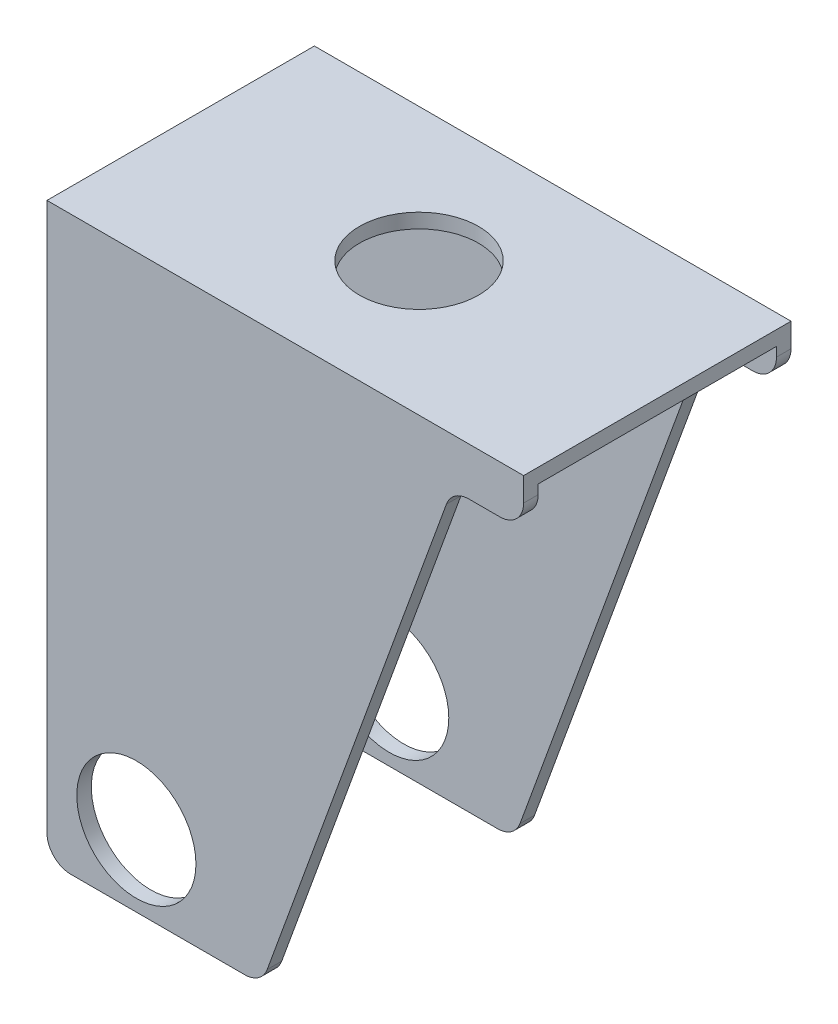
ISO-10303-21;
HEADER;
FILE_DESCRIPTION(('STEP AP214'),'2;1');
FILE_NAME('part.step','',(''),(''),'','','');
FILE_SCHEMA(('AUTOMOTIVE_DESIGN { 1 0 10303 214 1 1 1 1 }'));
ENDSEC;
DATA;
#1=APPLICATION_CONTEXT('core data for automotive mechanical design processes');
#2=APPLICATION_PROTOCOL_DEFINITION('international standard','automotive_design',2000,#1);
#3=PRODUCT_CONTEXT('',#1,'mechanical');
#4=PRODUCT('Part','Part','',(#3));
#5=PRODUCT_RELATED_PRODUCT_CATEGORY('part','',(#4));
#6=PRODUCT_DEFINITION_FORMATION('','',#4);
#7=PRODUCT_DEFINITION_CONTEXT('part definition',#1,'design');
#8=PRODUCT_DEFINITION('design','',#6,#7);
#9=PRODUCT_DEFINITION_SHAPE('','',#8);
#10=(LENGTH_UNIT() NAMED_UNIT(*) SI_UNIT(.MILLI.,.METRE.));
#11=(NAMED_UNIT(*) PLANE_ANGLE_UNIT() SI_UNIT($,.RADIAN.));
#12=(NAMED_UNIT(*) SI_UNIT($,.STERADIAN.) SOLID_ANGLE_UNIT());
#13=UNCERTAINTY_MEASURE_WITH_UNIT(LENGTH_MEASURE(1.E-05),#10,'distance_accuracy_value','');
#14=(GEOMETRIC_REPRESENTATION_CONTEXT(3) GLOBAL_UNCERTAINTY_ASSIGNED_CONTEXT((#13)) GLOBAL_UNIT_ASSIGNED_CONTEXT((#10,
#11,#12)) REPRESENTATION_CONTEXT('',''));
#15=CARTESIAN_POINT('',(0.,0.,0.));
#16=DIRECTION('',(0.,0.,1.));
#17=DIRECTION('',(1.,0.,0.));
#18=AXIS2_PLACEMENT_3D('',#15,#16,#17);
#19=CARTESIAN_POINT('',(50.8,59.3852,-12.7));
#20=DIRECTION('',(0.,0.,-1.));
#21=DIRECTION('',(0.,1.,0.));
#22=AXIS2_PLACEMENT_3D('',#19,#20,#21);
#23=PLANE('',#22);
#24=CARTESIAN_POINT('',(9.525,7.62,-12.7));
#25=DIRECTION('',(0.,0.,-1.));
#26=DIRECTION('',(0.,1.,0.));
#27=AXIS2_PLACEMENT_3D('',#24,#25,#26);
#28=CIRCLE('',#27,6.35);
#29=CARTESIAN_POINT('',(9.525,13.97,-12.7));
#30=VERTEX_POINT('',#29);
#31=EDGE_CURVE('E215',#30,#30,#28,.T.);
#32=ORIENTED_EDGE('',*,*,#31,.T.);
#33=EDGE_LOOP('',(#32));
#34=FACE_BOUND('',#33,.T.);
#35=DIRECTION('',(0.,-1.,0.));
#36=VECTOR('',#35,1.);
#37=CARTESIAN_POINT('',(0.,59.3852,-12.7));
#38=LINE('',#37,#36);
#39=CARTESIAN_POINT('',(0.,59.3852,-12.7));
#40=VERTEX_POINT('',#39);
#41=CARTESIAN_POINT('',(0.,2.54,-12.7));
#42=VERTEX_POINT('',#41);
#43=EDGE_CURVE('E212',#40,#42,#38,.T.);
#44=ORIENTED_EDGE('',*,*,#43,.T.);
#45=CARTESIAN_POINT('',(2.54,2.54,-12.7));
#46=DIRECTION('',(0.,0.,-1.));
#47=DIRECTION('',(0.,1.,0.));
#48=AXIS2_PLACEMENT_3D('',#45,#46,#47);
#49=CIRCLE('',#48,2.54);
#50=CARTESIAN_POINT('',(2.54,0.,-12.7));
#51=VERTEX_POINT('',#50);
#52=EDGE_CURVE('E267',#42,#51,#49,.F.);
#53=ORIENTED_EDGE('',*,*,#52,.T.);
#54=DIRECTION('',(-1.,0.,0.));
#55=VECTOR('',#54,1.);
#56=CARTESIAN_POINT('',(50.8,0.,-12.7));
#57=LINE('',#56,#55);
#58=CARTESIAN_POINT('',(21.0811912038495,0.,-12.7));
#59=VERTEX_POINT('',#58);
#60=EDGE_CURVE('E238',#59,#51,#57,.T.);
#61=ORIENTED_EDGE('',*,*,#60,.F.);
#62=CARTESIAN_POINT('',(21.0811912038495,2.54,-12.7));
#63=DIRECTION('',(0.,0.,-1.));
#64=DIRECTION('',(0.,1.,0.));
#65=AXIS2_PLACEMENT_3D('',#62,#63,#64);
#66=CIRCLE('',#65,2.54);
#67=CARTESIAN_POINT('',(23.4681397038359,1.67162401091899,-12.7));
#68=VERTEX_POINT('',#67);
#69=EDGE_CURVE('E265',#59,#68,#66,.F.);
#70=ORIENTED_EDGE('',*,*,#69,.T.);
#71=DIRECTION('',(0.341880310661818,0.939743503931673,0.));
#72=VECTOR('',#71,1.);
#73=CARTESIAN_POINT('',(45.2049524244005,61.420687976571,-12.7));
#74=LINE('',#73,#72);
#75=CARTESIAN_POINT('',(42.5718602961641,54.182975989081,-12.7));
#76=VERTEX_POINT('',#75);
#77=EDGE_CURVE('E247',#68,#76,#74,.T.);
#78=ORIENTED_EDGE('',*,*,#77,.T.);
#79=CARTESIAN_POINT('',(44.9588087961505,53.3146,-12.7));
#80=DIRECTION('',(0.,0.,-1.));
#81=DIRECTION('',(0.,1.,0.));
#82=AXIS2_PLACEMENT_3D('',#79,#80,#81);
#83=CIRCLE('',#82,2.54);
#84=CARTESIAN_POINT('',(44.9588087961505,55.8546,-12.7));
#85=VERTEX_POINT('',#84);
#86=EDGE_CURVE('E307',#76,#85,#83,.T.);
#87=ORIENTED_EDGE('',*,*,#86,.T.);
#88=DIRECTION('',(1.,0.,0.));
#89=VECTOR('',#88,1.);
#90=CARTESIAN_POINT('',(50.8,55.8546,-12.7));
#91=LINE('',#90,#89);
#92=CARTESIAN_POINT('',(48.26,55.8546,-12.7));
#93=VERTEX_POINT('',#92);
#94=EDGE_CURVE('E364',#85,#93,#91,.T.);
#95=ORIENTED_EDGE('',*,*,#94,.T.);
#96=CARTESIAN_POINT('',(48.26,58.3946,-12.7));
#97=DIRECTION('',(0.,0.,-1.));
#98=DIRECTION('',(0.,1.,0.));
#99=AXIS2_PLACEMENT_3D('',#96,#97,#98);
#100=CIRCLE('',#99,2.54);
#101=CARTESIAN_POINT('',(50.8,58.3946,-12.7));
#102=VERTEX_POINT('',#101);
#103=EDGE_CURVE('E263',#93,#102,#100,.F.);
#104=ORIENTED_EDGE('',*,*,#103,.T.);
#105=DIRECTION('',(0.,-1.,0.));
#106=VECTOR('',#105,1.);
#107=CARTESIAN_POINT('',(50.8,59.3852,-12.7));
#108=LINE('',#107,#106);
#109=CARTESIAN_POINT('',(50.8,59.3852,-12.7));
#110=VERTEX_POINT('',#109);
#111=EDGE_CURVE('E186',#110,#102,#108,.T.);
#112=ORIENTED_EDGE('',*,*,#111,.F.);
#113=DIRECTION('',(-1.,0.,0.));
#114=VECTOR('',#113,1.);
#115=CARTESIAN_POINT('',(50.8,59.3852,-12.7));
#116=LINE('',#115,#114);
#117=EDGE_CURVE('E211',#110,#40,#116,.T.);
#118=ORIENTED_EDGE('',*,*,#117,.T.);
#119=EDGE_LOOP('',(#44,#53,#61,#70,#78,#87,#95,#104,#112,#118));
#120=FACE_BOUND('',#119,.T.);
#121=ADVANCED_FACE('F36',(#34,#120),#23,.F.);
#122=CARTESIAN_POINT('',(50.8,0.,-12.7));
#123=DIRECTION('',(0.,1.,0.));
#124=DIRECTION('',(0.,0.,1.));
#125=AXIS2_PLACEMENT_3D('',#122,#123,#124);
#126=PLANE('',#125);
#127=ORIENTED_EDGE('',*,*,#60,.T.);
#128=DIRECTION('',(0.,0.,-1.));
#129=VECTOR('',#128,1.);
#130=CARTESIAN_POINT('',(2.54,0.,-12.7));
#131=LINE('',#130,#129);
#132=CARTESIAN_POINT('',(2.54,0.,-14.2494));
#133=VERTEX_POINT('',#132);
#134=EDGE_CURVE('E250',#51,#133,#131,.T.);
#135=ORIENTED_EDGE('',*,*,#134,.T.);
#136=DIRECTION('',(-1.,0.,0.));
#137=VECTOR('',#136,1.);
#138=CARTESIAN_POINT('',(50.8,0.,-14.2494));
#139=LINE('',#138,#137);
#140=CARTESIAN_POINT('',(21.0811912038495,0.,-14.2494));
#141=VERTEX_POINT('',#140);
#142=EDGE_CURVE('E196',#141,#133,#139,.T.);
#143=ORIENTED_EDGE('',*,*,#142,.F.);
#144=DIRECTION('',(0.,0.,1.));
#145=VECTOR('',#144,1.);
#146=CARTESIAN_POINT('',(21.0811912038495,0.,-12.7));
#147=LINE('',#146,#145);
#148=EDGE_CURVE('E243',#141,#59,#147,.T.);
#149=ORIENTED_EDGE('',*,*,#148,.T.);
#150=EDGE_LOOP('',(#127,#135,#143,#149));
#151=FACE_BOUND('',#150,.T.);
#152=ADVANCED_FACE('F397',(#151),#126,.F.);
#153=CARTESIAN_POINT('',(50.8,0.,-14.2494));
#154=DIRECTION('',(0.,0.,1.));
#155=DIRECTION('',(1.,0.,0.));
#156=AXIS2_PLACEMENT_3D('',#153,#154,#155);
#157=PLANE('',#156);
#158=CARTESIAN_POINT('',(9.525,7.62,-14.2494));
#159=DIRECTION('',(0.,0.,1.));
#160=DIRECTION('',(1.,0.,0.));
#161=AXIS2_PLACEMENT_3D('',#158,#159,#160);
#162=CIRCLE('',#161,6.35);
#163=CARTESIAN_POINT('',(15.875,7.62,-14.2494));
#164=VERTEX_POINT('',#163);
#165=EDGE_CURVE('E367',#164,#164,#162,.T.);
#166=ORIENTED_EDGE('',*,*,#165,.T.);
#167=EDGE_LOOP('',(#166));
#168=FACE_BOUND('',#167,.T.);
#169=ORIENTED_EDGE('',*,*,#142,.T.);
#170=CARTESIAN_POINT('',(2.54,2.54,-14.2494));
#171=DIRECTION('',(0.,0.,1.));
#172=DIRECTION('',(1.,0.,0.));
#173=AXIS2_PLACEMENT_3D('',#170,#171,#172);
#174=CIRCLE('',#173,2.54);
#175=CARTESIAN_POINT('',(0.,2.54,-14.2494));
#176=VERTEX_POINT('',#175);
#177=EDGE_CURVE('E257',#133,#176,#174,.F.);
#178=ORIENTED_EDGE('',*,*,#177,.T.);
#179=DIRECTION('',(0.,1.,0.));
#180=VECTOR('',#179,1.);
#181=CARTESIAN_POINT('',(0.,0.,-14.2494));
#182=LINE('',#181,#180);
#183=CARTESIAN_POINT('',(0.,60.9346,-14.2494));
#184=VERTEX_POINT('',#183);
#185=EDGE_CURVE('E193',#176,#184,#182,.T.);
#186=ORIENTED_EDGE('',*,*,#185,.T.);
#187=DIRECTION('',(-1.,0.,0.));
#188=VECTOR('',#187,1.);
#189=CARTESIAN_POINT('',(50.8,60.9346,-14.2494));
#190=LINE('',#189,#188);
#191=CARTESIAN_POINT('',(50.8,60.9346,-14.2494));
#192=VERTEX_POINT('',#191);
#193=EDGE_CURVE('E189',#192,#184,#190,.T.);
#194=ORIENTED_EDGE('',*,*,#193,.F.);
#195=DIRECTION('',(0.,1.,0.));
#196=VECTOR('',#195,1.);
#197=CARTESIAN_POINT('',(50.8,0.,-14.2494));
#198=LINE('',#197,#196);
#199=CARTESIAN_POINT('',(50.8,58.3946,-14.2494));
#200=VERTEX_POINT('',#199);
#201=EDGE_CURVE('E174',#200,#192,#198,.T.);
#202=ORIENTED_EDGE('',*,*,#201,.F.);
#203=CARTESIAN_POINT('',(48.26,58.3946,-14.2494));
#204=DIRECTION('',(0.,0.,1.));
#205=DIRECTION('',(1.,0.,0.));
#206=AXIS2_PLACEMENT_3D('',#203,#204,#205);
#207=CIRCLE('',#206,2.54);
#208=CARTESIAN_POINT('',(48.26,55.8546,-14.2494));
#209=VERTEX_POINT('',#208);
#210=EDGE_CURVE('E253',#200,#209,#207,.F.);
#211=ORIENTED_EDGE('',*,*,#210,.T.);
#212=DIRECTION('',(-1.,0.,0.));
#213=VECTOR('',#212,1.);
#214=CARTESIAN_POINT('',(50.8,55.8546,-14.2494));
#215=LINE('',#214,#213);
#216=CARTESIAN_POINT('',(44.9588087961505,55.8546,-14.2494));
#217=VERTEX_POINT('',#216);
#218=EDGE_CURVE('E368',#209,#217,#215,.T.);
#219=ORIENTED_EDGE('',*,*,#218,.T.);
#220=CARTESIAN_POINT('',(44.9588087961505,53.3146,-14.2494));
#221=DIRECTION('',(0.,0.,1.));
#222=DIRECTION('',(1.,0.,0.));
#223=AXIS2_PLACEMENT_3D('',#220,#221,#222);
#224=CIRCLE('',#223,2.54);
#225=CARTESIAN_POINT('',(42.5718602961641,54.182975989081,-14.2494));
#226=VERTEX_POINT('',#225);
#227=EDGE_CURVE('E309',#217,#226,#224,.T.);
#228=ORIENTED_EDGE('',*,*,#227,.T.);
#229=DIRECTION('',(-0.341880310661818,-0.939743503931673,0.));
#230=VECTOR('',#229,1.);
#231=CARTESIAN_POINT('',(43.18,55.8546,-14.2494));
#232=LINE('',#231,#230);
#233=CARTESIAN_POINT('',(23.4681397038359,1.67162401091898,-14.2494));
#234=VERTEX_POINT('',#233);
#235=EDGE_CURVE('E370',#226,#234,#232,.T.);
#236=ORIENTED_EDGE('',*,*,#235,.T.);
#237=CARTESIAN_POINT('',(21.0811912038495,2.54,-14.2494));
#238=DIRECTION('',(0.,0.,1.));
#239=DIRECTION('',(1.,0.,0.));
#240=AXIS2_PLACEMENT_3D('',#237,#238,#239);
#241=CIRCLE('',#240,2.54);
#242=EDGE_CURVE('E255',#234,#141,#241,.F.);
#243=ORIENTED_EDGE('',*,*,#242,.T.);
#244=EDGE_LOOP('',(#169,#178,#186,#194,#202,#211,#219,#228,#236,#243));
#245=FACE_BOUND('',#244,.T.);
#246=ADVANCED_FACE('F191',(#168,#245),#157,.F.);
#247=CARTESIAN_POINT('',(50.8,60.9346,-14.2494));
#248=DIRECTION('',(0.,-1.,0.));
#249=DIRECTION('',(0.,0.,-1.));
#250=AXIS2_PLACEMENT_3D('',#247,#248,#249);
#251=PLANE('',#250);
#252=CARTESIAN_POINT('',(25.4,60.9346,0.));
#253=DIRECTION('',(0.,1.,0.));
#254=DIRECTION('',(0.,0.,1.));
#255=AXIS2_PLACEMENT_3D('',#252,#253,#254);
#256=CIRCLE('',#255,6.35);
#257=CARTESIAN_POINT('',(25.4,60.9346,6.35));
#258=VERTEX_POINT('',#257);
#259=EDGE_CURVE('E382',#258,#258,#256,.T.);
#260=ORIENTED_EDGE('',*,*,#259,.F.);
#261=EDGE_LOOP('',(#260));
#262=FACE_BOUND('',#261,.T.);
#263=DIRECTION('',(0.,0.,1.));
#264=VECTOR('',#263,1.);
#265=CARTESIAN_POINT('',(0.,60.9346,-14.2494));
#266=LINE('',#265,#264);
#267=CARTESIAN_POINT('',(0.,60.9346,14.2494));
#268=VERTEX_POINT('',#267);
#269=EDGE_CURVE('E217',#184,#268,#266,.T.);
#270=ORIENTED_EDGE('',*,*,#269,.T.);
#271=DIRECTION('',(-1.,0.,0.));
#272=VECTOR('',#271,1.);
#273=CARTESIAN_POINT('',(50.8,60.9346,14.2494));
#274=LINE('',#273,#272);
#275=CARTESIAN_POINT('',(50.8,60.9346,14.2494));
#276=VERTEX_POINT('',#275);
#277=EDGE_CURVE('E197',#276,#268,#274,.T.);
#278=ORIENTED_EDGE('',*,*,#277,.F.);
#279=DIRECTION('',(0.,0.,1.));
#280=VECTOR('',#279,1.);
#281=CARTESIAN_POINT('',(50.8,60.9346,-14.2494));
#282=LINE('',#281,#280);
#283=EDGE_CURVE('E180',#192,#276,#282,.T.);
#284=ORIENTED_EDGE('',*,*,#283,.F.);
#285=ORIENTED_EDGE('',*,*,#193,.T.);
#286=EDGE_LOOP('',(#270,#278,#284,#285));
#287=FACE_BOUND('',#286,.T.);
#288=ADVANCED_FACE('F199',(#262,#287),#251,.F.);
#289=CARTESIAN_POINT('',(50.8,60.9346,14.2494));
#290=DIRECTION('',(0.,0.,-1.));
#291=DIRECTION('',(0.,1.,0.));
#292=AXIS2_PLACEMENT_3D('',#289,#290,#291);
#293=PLANE('',#292);
#294=CARTESIAN_POINT('',(9.525,7.62,14.2494));
#295=DIRECTION('',(0.,0.,1.));
#296=DIRECTION('',(1.,0.,0.));
#297=AXIS2_PLACEMENT_3D('',#294,#295,#296);
#298=CIRCLE('',#297,6.35);
#299=CARTESIAN_POINT('',(15.875,7.62,14.2494));
#300=VERTEX_POINT('',#299);
#301=EDGE_CURVE('E373',#300,#300,#298,.T.);
#302=ORIENTED_EDGE('',*,*,#301,.F.);
#303=EDGE_LOOP('',(#302));
#304=FACE_BOUND('',#303,.T.);
#305=DIRECTION('',(-1.,0.,0.));
#306=VECTOR('',#305,1.);
#307=CARTESIAN_POINT('',(50.8,55.8546,14.2494));
#308=LINE('',#307,#306);
#309=CARTESIAN_POINT('',(48.26,55.8546,14.2494));
#310=VERTEX_POINT('',#309);
#311=CARTESIAN_POINT('',(44.9588087961505,55.8546,14.2494));
#312=VERTEX_POINT('',#311);
#313=EDGE_CURVE('E315',#310,#312,#308,.T.);
#314=ORIENTED_EDGE('',*,*,#313,.F.);
#315=CARTESIAN_POINT('',(48.26,58.3946,14.2494));
#316=DIRECTION('',(0.,0.,-1.));
#317=DIRECTION('',(0.,1.,0.));
#318=AXIS2_PLACEMENT_3D('',#315,#316,#317);
#319=CIRCLE('',#318,2.54);
#320=CARTESIAN_POINT('',(50.8,58.3946,14.2494));
#321=VERTEX_POINT('',#320);
#322=EDGE_CURVE('E291',#310,#321,#319,.F.);
#323=ORIENTED_EDGE('',*,*,#322,.T.);
#324=DIRECTION('',(0.,-1.,0.));
#325=VECTOR('',#324,1.);
#326=CARTESIAN_POINT('',(50.8,60.9346,14.2494));
#327=LINE('',#326,#325);
#328=EDGE_CURVE('E202',#276,#321,#327,.T.);
#329=ORIENTED_EDGE('',*,*,#328,.F.);
#330=ORIENTED_EDGE('',*,*,#277,.T.);
#331=DIRECTION('',(0.,-1.,0.));
#332=VECTOR('',#331,1.);
#333=CARTESIAN_POINT('',(0.,60.9346,14.2494));
#334=LINE('',#333,#332);
#335=CARTESIAN_POINT('',(0.,2.54,14.2494));
#336=VERTEX_POINT('',#335);
#337=EDGE_CURVE('E219',#268,#336,#334,.T.);
#338=ORIENTED_EDGE('',*,*,#337,.T.);
#339=CARTESIAN_POINT('',(2.54,2.54,14.2494));
#340=DIRECTION('',(0.,0.,-1.));
#341=DIRECTION('',(0.,1.,0.));
#342=AXIS2_PLACEMENT_3D('',#339,#340,#341);
#343=CIRCLE('',#342,2.54);
#344=CARTESIAN_POINT('',(2.54,0.,14.2494));
#345=VERTEX_POINT('',#344);
#346=EDGE_CURVE('E289',#336,#345,#343,.F.);
#347=ORIENTED_EDGE('',*,*,#346,.T.);
#348=DIRECTION('',(-1.,0.,0.));
#349=VECTOR('',#348,1.);
#350=CARTESIAN_POINT('',(50.8,0.,14.2494));
#351=LINE('',#350,#349);
#352=CARTESIAN_POINT('',(21.0811912038495,0.,14.2494));
#353=VERTEX_POINT('',#352);
#354=EDGE_CURVE('E233',#353,#345,#351,.T.);
#355=ORIENTED_EDGE('',*,*,#354,.F.);
#356=CARTESIAN_POINT('',(21.0811912038495,2.54,14.2494));
#357=DIRECTION('',(0.,0.,-1.));
#358=DIRECTION('',(0.,1.,0.));
#359=AXIS2_PLACEMENT_3D('',#356,#357,#358);
#360=CIRCLE('',#359,2.54);
#361=CARTESIAN_POINT('',(23.4681397038359,1.67162401091898,14.2494));
#362=VERTEX_POINT('',#361);
#363=EDGE_CURVE('E287',#353,#362,#360,.F.);
#364=ORIENTED_EDGE('',*,*,#363,.T.);
#365=DIRECTION('',(-0.341880310661818,-0.939743503931673,0.));
#366=VECTOR('',#365,1.);
#367=CARTESIAN_POINT('',(43.18,55.8546,14.2494));
#368=LINE('',#367,#366);
#369=CARTESIAN_POINT('',(42.5718602961641,54.182975989081,14.2494));
#370=VERTEX_POINT('',#369);
#371=EDGE_CURVE('E317',#370,#362,#368,.T.);
#372=ORIENTED_EDGE('',*,*,#371,.F.);
#373=CARTESIAN_POINT('',(44.9588087961505,53.3146,14.2494));
#374=DIRECTION('',(0.,0.,-1.));
#375=DIRECTION('',(0.,1.,0.));
#376=AXIS2_PLACEMENT_3D('',#373,#374,#375);
#377=CIRCLE('',#376,2.54);
#378=EDGE_CURVE('E44',#370,#312,#377,.T.);
#379=ORIENTED_EDGE('',*,*,#378,.T.);
#380=EDGE_LOOP('',(#314,#323,#329,#330,#338,#347,#355,#364,#372,#379));
#381=FACE_BOUND('',#380,.T.);
#382=ADVANCED_FACE('F314',(#304,#381),#293,.F.);
#383=CARTESIAN_POINT('',(50.8,0.,14.2494));
#384=DIRECTION('',(0.,1.,0.));
#385=DIRECTION('',(0.,0.,1.));
#386=AXIS2_PLACEMENT_3D('',#383,#384,#385);
#387=PLANE('',#386);
#388=ORIENTED_EDGE('',*,*,#354,.T.);
#389=DIRECTION('',(0.,0.,-1.));
#390=VECTOR('',#389,1.);
#391=CARTESIAN_POINT('',(2.54,0.,14.2494));
#392=LINE('',#391,#390);
#393=CARTESIAN_POINT('',(2.54,0.,12.7));
#394=VERTEX_POINT('',#393);
#395=EDGE_CURVE('E305',#345,#394,#392,.T.);
#396=ORIENTED_EDGE('',*,*,#395,.T.);
#397=DIRECTION('',(-1.,0.,0.));
#398=VECTOR('',#397,1.);
#399=CARTESIAN_POINT('',(50.8,0.,12.7));
#400=LINE('',#399,#398);
#401=CARTESIAN_POINT('',(21.0811912038495,0.,12.7));
#402=VERTEX_POINT('',#401);
#403=EDGE_CURVE('E231',#402,#394,#400,.T.);
#404=ORIENTED_EDGE('',*,*,#403,.F.);
#405=DIRECTION('',(0.,0.,1.));
#406=VECTOR('',#405,1.);
#407=CARTESIAN_POINT('',(21.0811912038495,0.,14.2494));
#408=LINE('',#407,#406);
#409=EDGE_CURVE('E302',#402,#353,#408,.T.);
#410=ORIENTED_EDGE('',*,*,#409,.T.);
#411=EDGE_LOOP('',(#388,#396,#404,#410));
#412=FACE_BOUND('',#411,.T.);
#413=ADVANCED_FACE('F341',(#412),#387,.F.);
#414=CARTESIAN_POINT('',(50.8,0.,12.7));
#415=DIRECTION('',(0.,0.,1.));
#416=DIRECTION('',(1.,0.,0.));
#417=AXIS2_PLACEMENT_3D('',#414,#415,#416);
#418=PLANE('',#417);
#419=CARTESIAN_POINT('',(9.525,7.62,12.7));
#420=DIRECTION('',(0.,0.,1.));
#421=DIRECTION('',(1.,0.,0.));
#422=AXIS2_PLACEMENT_3D('',#419,#420,#421);
#423=CIRCLE('',#422,6.35);
#424=CARTESIAN_POINT('',(15.875,7.62,12.7));
#425=VERTEX_POINT('',#424);
#426=EDGE_CURVE('E244',#425,#425,#423,.T.);
#427=ORIENTED_EDGE('',*,*,#426,.T.);
#428=EDGE_LOOP('',(#427));
#429=FACE_BOUND('',#428,.T.);
#430=DIRECTION('',(0.,1.,0.));
#431=VECTOR('',#430,1.);
#432=CARTESIAN_POINT('',(50.8,0.,12.7));
#433=LINE('',#432,#431);
#434=CARTESIAN_POINT('',(50.8,58.3946,12.7));
#435=VERTEX_POINT('',#434);
#436=CARTESIAN_POINT('',(50.8,59.3852,12.7));
#437=VERTEX_POINT('',#436);
#438=EDGE_CURVE('E204',#435,#437,#433,.T.);
#439=ORIENTED_EDGE('',*,*,#438,.F.);
#440=CARTESIAN_POINT('',(48.26,58.3946,12.7));
#441=DIRECTION('',(0.,0.,1.));
#442=DIRECTION('',(1.,0.,0.));
#443=AXIS2_PLACEMENT_3D('',#440,#441,#442);
#444=CIRCLE('',#443,2.54);
#445=CARTESIAN_POINT('',(48.26,55.8546,12.7));
#446=VERTEX_POINT('',#445);
#447=EDGE_CURVE('E295',#435,#446,#444,.F.);
#448=ORIENTED_EDGE('',*,*,#447,.T.);
#449=DIRECTION('',(-1.,0.,0.));
#450=VECTOR('',#449,1.);
#451=CARTESIAN_POINT('',(50.8,55.8546,12.7));
#452=LINE('',#451,#450);
#453=CARTESIAN_POINT('',(44.9588087961505,55.8546,12.7));
#454=VERTEX_POINT('',#453);
#455=EDGE_CURVE('E333',#446,#454,#452,.T.);
#456=ORIENTED_EDGE('',*,*,#455,.T.);
#457=CARTESIAN_POINT('',(44.9588087961505,53.3146,12.7));
#458=DIRECTION('',(0.,0.,1.));
#459=DIRECTION('',(1.,0.,0.));
#460=AXIS2_PLACEMENT_3D('',#457,#458,#459);
#461=CIRCLE('',#460,2.54);
#462=CARTESIAN_POINT('',(42.5718602961641,54.182975989081,12.7));
#463=VERTEX_POINT('',#462);
#464=EDGE_CURVE('E11',#454,#463,#461,.T.);
#465=ORIENTED_EDGE('',*,*,#464,.T.);
#466=DIRECTION('',(-0.341880310661818,-0.939743503931673,0.));
#467=VECTOR('',#466,1.);
#468=CARTESIAN_POINT('',(26.1256871821011,8.97655764180042,12.7));
#469=LINE('',#468,#467);
#470=CARTESIAN_POINT('',(23.4681397038359,1.67162401091898,12.7));
#471=VERTEX_POINT('',#470);
#472=EDGE_CURVE('E241',#463,#471,#469,.T.);
#473=ORIENTED_EDGE('',*,*,#472,.T.);
#474=CARTESIAN_POINT('',(21.0811912038495,2.54,12.7));
#475=DIRECTION('',(0.,0.,1.));
#476=DIRECTION('',(1.,0.,0.));
#477=AXIS2_PLACEMENT_3D('',#474,#475,#476);
#478=CIRCLE('',#477,2.54);
#479=EDGE_CURVE('E59',#471,#402,#478,.F.);
#480=ORIENTED_EDGE('',*,*,#479,.T.);
#481=ORIENTED_EDGE('',*,*,#403,.T.);
#482=CARTESIAN_POINT('',(2.54,2.54,12.7));
#483=DIRECTION('',(0.,0.,1.));
#484=DIRECTION('',(1.,0.,0.));
#485=AXIS2_PLACEMENT_3D('',#482,#483,#484);
#486=CIRCLE('',#485,2.54);
#487=CARTESIAN_POINT('',(0.,2.54,12.7));
#488=VERTEX_POINT('',#487);
#489=EDGE_CURVE('E51',#394,#488,#486,.F.);
#490=ORIENTED_EDGE('',*,*,#489,.T.);
#491=DIRECTION('',(0.,1.,0.));
#492=VECTOR('',#491,1.);
#493=CARTESIAN_POINT('',(0.,0.,12.7));
#494=LINE('',#493,#492);
#495=CARTESIAN_POINT('',(0.,59.3852,12.7));
#496=VERTEX_POINT('',#495);
#497=EDGE_CURVE('E222',#488,#496,#494,.T.);
#498=ORIENTED_EDGE('',*,*,#497,.T.);
#499=DIRECTION('',(-1.,0.,0.));
#500=VECTOR('',#499,1.);
#501=CARTESIAN_POINT('',(50.8,59.3852,12.7));
#502=LINE('',#501,#500);
#503=EDGE_CURVE('E228',#437,#496,#502,.T.);
#504=ORIENTED_EDGE('',*,*,#503,.F.);
#505=EDGE_LOOP('',(#439,#448,#456,#465,#473,#480,#481,#490,#498,#504));
#506=FACE_BOUND('',#505,.T.);
#507=ADVANCED_FACE('F332',(#429,#506),#418,.F.);
#508=CARTESIAN_POINT('',(50.8,59.3852,12.7));
#509=DIRECTION('',(0.,1.,0.));
#510=DIRECTION('',(0.,0.,1.));
#511=AXIS2_PLACEMENT_3D('',#508,#509,#510);
#512=PLANE('',#511);
#513=CARTESIAN_POINT('',(25.4,59.3852,0.));
#514=DIRECTION('',(0.,1.,0.));
#515=DIRECTION('',(0.,0.,1.));
#516=AXIS2_PLACEMENT_3D('',#513,#514,#515);
#517=CIRCLE('',#516,6.35);
#518=CARTESIAN_POINT('',(25.4,59.3852,6.35));
#519=VERTEX_POINT('',#518);
#520=EDGE_CURVE('E326',#519,#519,#517,.F.);
#521=ORIENTED_EDGE('',*,*,#520,.F.);
#522=EDGE_LOOP('',(#521));
#523=FACE_BOUND('',#522,.T.);
#524=DIRECTION('',(0.,0.,-1.));
#525=VECTOR('',#524,1.);
#526=CARTESIAN_POINT('',(0.,59.3852,12.7));
#527=LINE('',#526,#525);
#528=EDGE_CURVE('E224',#496,#40,#527,.T.);
#529=ORIENTED_EDGE('',*,*,#528,.T.);
#530=ORIENTED_EDGE('',*,*,#117,.F.);
#531=DIRECTION('',(0.,0.,-1.));
#532=VECTOR('',#531,1.);
#533=CARTESIAN_POINT('',(50.8,59.3852,12.7));
#534=LINE('',#533,#532);
#535=EDGE_CURVE('E209',#437,#110,#534,.T.);
#536=ORIENTED_EDGE('',*,*,#535,.F.);
#537=ORIENTED_EDGE('',*,*,#503,.T.);
#538=EDGE_LOOP('',(#529,#530,#536,#537));
#539=FACE_BOUND('',#538,.T.);
#540=ADVANCED_FACE('F353',(#523,#539),#512,.F.);
#541=CARTESIAN_POINT('',(50.8,0.,0.));
#542=DIRECTION('',(1.,0.,0.));
#543=DIRECTION('',(0.,0.,-1.));
#544=AXIS2_PLACEMENT_3D('',#541,#542,#543);
#545=PLANE('',#544);
#546=ORIENTED_EDGE('',*,*,#111,.T.);
#547=DIRECTION('',(0.,0.,1.));
#548=VECTOR('',#547,1.);
#549=CARTESIAN_POINT('',(50.8,58.3946,-14.2494));
#550=LINE('',#549,#548);
#551=EDGE_CURVE('E183',#102,#200,#550,.F.);
#552=ORIENTED_EDGE('',*,*,#551,.T.);
#553=ORIENTED_EDGE('',*,*,#201,.T.);
#554=ORIENTED_EDGE('',*,*,#283,.T.);
#555=ORIENTED_EDGE('',*,*,#328,.T.);
#556=DIRECTION('',(0.,0.,1.));
#557=VECTOR('',#556,1.);
#558=CARTESIAN_POINT('',(50.8,58.3946,12.7));
#559=LINE('',#558,#557);
#560=EDGE_CURVE('E279',#321,#435,#559,.F.);
#561=ORIENTED_EDGE('',*,*,#560,.T.);
#562=ORIENTED_EDGE('',*,*,#438,.T.);
#563=ORIENTED_EDGE('',*,*,#535,.T.);
#564=EDGE_LOOP('',(#546,#552,#553,#554,#555,#561,#562,#563));
#565=FACE_BOUND('',#564,.T.);
#566=ADVANCED_FACE('F177',(#565),#545,.T.);
#567=CARTESIAN_POINT('',(0.,0.,0.));
#568=DIRECTION('',(1.,0.,0.));
#569=DIRECTION('',(0.,0.,-1.));
#570=AXIS2_PLACEMENT_3D('',#567,#568,#569);
#571=PLANE('',#570);
#572=ORIENTED_EDGE('',*,*,#185,.F.);
#573=DIRECTION('',(0.,0.,-1.));
#574=VECTOR('',#573,1.);
#575=CARTESIAN_POINT('',(0.,2.54,0.));
#576=LINE('',#575,#574);
#577=EDGE_CURVE('E261',#176,#42,#576,.F.);
#578=ORIENTED_EDGE('',*,*,#577,.T.);
#579=ORIENTED_EDGE('',*,*,#43,.F.);
#580=ORIENTED_EDGE('',*,*,#528,.F.);
#581=ORIENTED_EDGE('',*,*,#497,.F.);
#582=DIRECTION('',(0.,0.,-1.));
#583=VECTOR('',#582,1.);
#584=CARTESIAN_POINT('',(0.,2.54,0.));
#585=LINE('',#584,#583);
#586=EDGE_CURVE('E259',#488,#336,#585,.F.);
#587=ORIENTED_EDGE('',*,*,#586,.T.);
#588=ORIENTED_EDGE('',*,*,#337,.F.);
#589=ORIENTED_EDGE('',*,*,#269,.F.);
#590=EDGE_LOOP('',(#572,#578,#579,#580,#581,#587,#588,#589));
#591=FACE_BOUND('',#590,.T.);
#592=ADVANCED_FACE('F349',(#591),#571,.F.);
#593=CARTESIAN_POINT('',(50.8,55.8546,-14.2494));
#594=DIRECTION('',(0.,1.,0.));
#595=DIRECTION('',(0.,0.,1.));
#596=AXIS2_PLACEMENT_3D('',#593,#594,#595);
#597=PLANE('',#596);
#598=ORIENTED_EDGE('',*,*,#455,.F.);
#599=DIRECTION('',(0.,0.,1.));
#600=VECTOR('',#599,1.);
#601=CARTESIAN_POINT('',(48.26,55.8546,14.2494));
#602=LINE('',#601,#600);
#603=EDGE_CURVE('E284',#446,#310,#602,.T.);
#604=ORIENTED_EDGE('',*,*,#603,.T.);
#605=ORIENTED_EDGE('',*,*,#313,.T.);
#606=DIRECTION('',(0.,0.,1.));
#607=VECTOR('',#606,1.);
#608=CARTESIAN_POINT('',(44.9588087961505,55.8546,12.7));
#609=LINE('',#608,#607);
#610=EDGE_CURVE('E282',#312,#454,#609,.F.);
#611=ORIENTED_EDGE('',*,*,#610,.T.);
#612=EDGE_LOOP('',(#598,#604,#605,#611));
#613=FACE_BOUND('',#612,.T.);
#614=ADVANCED_FACE('F323',(#613),#597,.F.);
#615=CARTESIAN_POINT('',(43.18,55.8546,-14.2494));
#616=DIRECTION('',(-0.939743503931673,0.341880310661818,0.));
#617=DIRECTION('',(-0.341880310661818,-0.939743503931673,0.));
#618=AXIS2_PLACEMENT_3D('',#615,#616,#617);
#619=PLANE('',#618);
#620=ORIENTED_EDGE('',*,*,#472,.F.);
#621=DIRECTION('',(0.,0.,1.));
#622=VECTOR('',#621,1.);
#623=CARTESIAN_POINT('',(42.5718602961641,54.182975989081,14.2494));
#624=LINE('',#623,#622);
#625=EDGE_CURVE('E299',#463,#370,#624,.T.);
#626=ORIENTED_EDGE('',*,*,#625,.T.);
#627=ORIENTED_EDGE('',*,*,#371,.T.);
#628=DIRECTION('',(0.,0.,1.));
#629=VECTOR('',#628,1.);
#630=CARTESIAN_POINT('',(23.4681397038359,1.67162401091898,-14.2494));
#631=LINE('',#630,#629);
#632=EDGE_CURVE('E297',#362,#471,#631,.F.);
#633=ORIENTED_EDGE('',*,*,#632,.T.);
#634=EDGE_LOOP('',(#620,#626,#627,#633));
#635=FACE_BOUND('',#634,.T.);
#636=ADVANCED_FACE('F335',(#635),#619,.F.);
#637=ORIENTED_EDGE('',*,*,#77,.F.);
#638=DIRECTION('',(0.,0.,1.));
#639=VECTOR('',#638,1.);
#640=CARTESIAN_POINT('',(23.4681397038359,1.67162401091898,-14.2494));
#641=LINE('',#640,#639);
#642=EDGE_CURVE('E272',#68,#234,#641,.F.);
#643=ORIENTED_EDGE('',*,*,#642,.T.);
#644=ORIENTED_EDGE('',*,*,#235,.F.);
#645=DIRECTION('',(0.,0.,1.));
#646=VECTOR('',#645,1.);
#647=CARTESIAN_POINT('',(42.5718602961641,54.182975989081,-12.7));
#648=LINE('',#647,#646);
#649=EDGE_CURVE('E269',#226,#76,#648,.T.);
#650=ORIENTED_EDGE('',*,*,#649,.T.);
#651=EDGE_LOOP('',(#637,#643,#644,#650));
#652=FACE_BOUND('',#651,.T.);
#653=ADVANCED_FACE('F446',(#652),#619,.F.);
#654=ORIENTED_EDGE('',*,*,#218,.F.);
#655=DIRECTION('',(0.,0.,1.));
#656=VECTOR('',#655,1.);
#657=CARTESIAN_POINT('',(48.26,55.8546,-12.7));
#658=LINE('',#657,#656);
#659=EDGE_CURVE('E276',#209,#93,#658,.T.);
#660=ORIENTED_EDGE('',*,*,#659,.T.);
#661=ORIENTED_EDGE('',*,*,#94,.F.);
#662=DIRECTION('',(0.,0.,1.));
#663=VECTOR('',#662,1.);
#664=CARTESIAN_POINT('',(44.9588087961505,55.8546,-14.2494));
#665=LINE('',#664,#663);
#666=EDGE_CURVE('E274',#85,#217,#665,.F.);
#667=ORIENTED_EDGE('',*,*,#666,.T.);
#668=EDGE_LOOP('',(#654,#660,#661,#667));
#669=FACE_BOUND('',#668,.T.);
#670=ADVANCED_FACE('F449',(#669),#597,.F.);
#671=CARTESIAN_POINT('',(9.525,7.62,-14.2494));
#672=DIRECTION('',(0.,0.,1.));
#673=DIRECTION('',(1.,0.,0.));
#674=AXIS2_PLACEMENT_3D('',#671,#672,#673);
#675=CYLINDRICAL_SURFACE('',#674,6.35);
#676=ORIENTED_EDGE('',*,*,#301,.T.);
#677=EDGE_LOOP('',(#676));
#678=FACE_BOUND('',#677,.T.);
#679=ORIENTED_EDGE('',*,*,#426,.F.);
#680=EDGE_LOOP('',(#679));
#681=FACE_BOUND('',#680,.T.);
#682=ADVANCED_FACE('F444',(#678,#681),#675,.F.);
#683=ORIENTED_EDGE('',*,*,#165,.F.);
#684=EDGE_LOOP('',(#683));
#685=FACE_BOUND('',#684,.T.);
#686=ORIENTED_EDGE('',*,*,#31,.F.);
#687=EDGE_LOOP('',(#686));
#688=FACE_BOUND('',#687,.T.);
#689=ADVANCED_FACE('F413',(#685,#688),#675,.F.);
#690=CARTESIAN_POINT('',(2.54,2.54,-12.7));
#691=DIRECTION('',(0.,0.,-1.));
#692=DIRECTION('',(0.,1.,0.));
#693=AXIS2_PLACEMENT_3D('',#690,#691,#692);
#694=CYLINDRICAL_SURFACE('',#693,2.54);
#695=ORIENTED_EDGE('',*,*,#52,.F.);
#696=ORIENTED_EDGE('',*,*,#577,.F.);
#697=ORIENTED_EDGE('',*,*,#177,.F.);
#698=ORIENTED_EDGE('',*,*,#134,.F.);
#699=EDGE_LOOP('',(#695,#696,#697,#698));
#700=FACE_BOUND('',#699,.T.);
#701=ADVANCED_FACE('F409',(#700),#694,.T.);
#702=CARTESIAN_POINT('',(21.0811912038495,2.54,-12.7));
#703=DIRECTION('',(0.,0.,1.));
#704=DIRECTION('',(0.,-1.,0.));
#705=AXIS2_PLACEMENT_3D('',#702,#703,#704);
#706=CYLINDRICAL_SURFACE('',#705,2.54);
#707=ORIENTED_EDGE('',*,*,#242,.F.);
#708=ORIENTED_EDGE('',*,*,#642,.F.);
#709=ORIENTED_EDGE('',*,*,#69,.F.);
#710=ORIENTED_EDGE('',*,*,#148,.F.);
#711=EDGE_LOOP('',(#707,#708,#709,#710));
#712=FACE_BOUND('',#711,.T.);
#713=ADVANCED_FACE('F412',(#712),#706,.T.);
#714=CARTESIAN_POINT('',(48.26,58.3946,-14.2494));
#715=DIRECTION('',(0.,0.,-1.));
#716=DIRECTION('',(-1.,0.,0.));
#717=AXIS2_PLACEMENT_3D('',#714,#715,#716);
#718=CYLINDRICAL_SURFACE('',#717,2.54);
#719=ORIENTED_EDGE('',*,*,#210,.F.);
#720=ORIENTED_EDGE('',*,*,#551,.F.);
#721=ORIENTED_EDGE('',*,*,#103,.F.);
#722=ORIENTED_EDGE('',*,*,#659,.F.);
#723=EDGE_LOOP('',(#719,#720,#721,#722));
#724=FACE_BOUND('',#723,.T.);
#725=ADVANCED_FACE('F417',(#724),#718,.T.);
#726=CARTESIAN_POINT('',(44.9588087961505,53.3146,-14.2494));
#727=DIRECTION('',(0.,0.,-1.));
#728=DIRECTION('',(-1.,0.,0.));
#729=AXIS2_PLACEMENT_3D('',#726,#727,#728);
#730=CYLINDRICAL_SURFACE('',#729,2.54);
#731=ORIENTED_EDGE('',*,*,#227,.F.);
#732=ORIENTED_EDGE('',*,*,#666,.F.);
#733=ORIENTED_EDGE('',*,*,#86,.F.);
#734=ORIENTED_EDGE('',*,*,#649,.F.);
#735=EDGE_LOOP('',(#731,#732,#733,#734));
#736=FACE_BOUND('',#735,.T.);
#737=ADVANCED_FACE('F421',(#736),#730,.F.);
#738=CARTESIAN_POINT('',(48.26,58.3946,-14.2494));
#739=DIRECTION('',(0.,0.,-1.));
#740=DIRECTION('',(-1.,0.,0.));
#741=AXIS2_PLACEMENT_3D('',#738,#739,#740);
#742=CYLINDRICAL_SURFACE('',#741,2.54);
#743=ORIENTED_EDGE('',*,*,#447,.F.);
#744=ORIENTED_EDGE('',*,*,#560,.F.);
#745=ORIENTED_EDGE('',*,*,#322,.F.);
#746=ORIENTED_EDGE('',*,*,#603,.F.);
#747=EDGE_LOOP('',(#743,#744,#745,#746));
#748=FACE_BOUND('',#747,.T.);
#749=ADVANCED_FACE('F425',(#748),#742,.T.);
#750=CARTESIAN_POINT('',(44.9588087961505,53.3146,-14.2494));
#751=DIRECTION('',(0.,0.,-1.));
#752=DIRECTION('',(-1.,0.,0.));
#753=AXIS2_PLACEMENT_3D('',#750,#751,#752);
#754=CYLINDRICAL_SURFACE('',#753,2.54);
#755=ORIENTED_EDGE('',*,*,#464,.F.);
#756=ORIENTED_EDGE('',*,*,#610,.F.);
#757=ORIENTED_EDGE('',*,*,#378,.F.);
#758=ORIENTED_EDGE('',*,*,#625,.F.);
#759=EDGE_LOOP('',(#755,#756,#757,#758));
#760=FACE_BOUND('',#759,.T.);
#761=ADVANCED_FACE('F329',(#760),#754,.F.);
#762=CARTESIAN_POINT('',(2.54,2.54,14.2494));
#763=DIRECTION('',(0.,0.,-1.));
#764=DIRECTION('',(-1.,0.,0.));
#765=AXIS2_PLACEMENT_3D('',#762,#763,#764);
#766=CYLINDRICAL_SURFACE('',#765,2.54);
#767=ORIENTED_EDGE('',*,*,#346,.F.);
#768=ORIENTED_EDGE('',*,*,#586,.F.);
#769=ORIENTED_EDGE('',*,*,#489,.F.);
#770=ORIENTED_EDGE('',*,*,#395,.F.);
#771=EDGE_LOOP('',(#767,#768,#769,#770));
#772=FACE_BOUND('',#771,.T.);
#773=ADVANCED_FACE('F344',(#772),#766,.T.);
#774=CARTESIAN_POINT('',(21.0811912038495,2.54,14.2494));
#775=DIRECTION('',(0.,0.,1.));
#776=DIRECTION('',(1.,0.,0.));
#777=AXIS2_PLACEMENT_3D('',#774,#775,#776);
#778=CYLINDRICAL_SURFACE('',#777,2.54);
#779=ORIENTED_EDGE('',*,*,#479,.F.);
#780=ORIENTED_EDGE('',*,*,#632,.F.);
#781=ORIENTED_EDGE('',*,*,#363,.F.);
#782=ORIENTED_EDGE('',*,*,#409,.F.);
#783=EDGE_LOOP('',(#779,#780,#781,#782));
#784=FACE_BOUND('',#783,.T.);
#785=ADVANCED_FACE('F38',(#784),#778,.T.);
#786=CARTESIAN_POINT('',(25.4,-0.001000000000001,0.));
#787=DIRECTION('',(0.,1.,0.));
#788=DIRECTION('',(0.,0.,1.));
#789=AXIS2_PLACEMENT_3D('',#786,#787,#788);
#790=CYLINDRICAL_SURFACE('',#789,6.35);
#791=ORIENTED_EDGE('',*,*,#259,.T.);
#792=EDGE_LOOP('',(#791));
#793=FACE_BOUND('',#792,.T.);
#794=ORIENTED_EDGE('',*,*,#520,.T.);
#795=EDGE_LOOP('',(#794));
#796=FACE_BOUND('',#795,.T.);
#797=ADVANCED_FACE('F386',(#793,#796),#790,.F.);
#798=CLOSED_SHELL('',(#121,#152,#246,#288,#382,#413,#507,#540,#566,#592,#614,#636,#653,#670,
#682,#689,#701,#713,#725,#737,#749,#761,#773,#785,#797));
#799=MANIFOLD_SOLID_BREP('B2',#798);
#800=ADVANCED_BREP_SHAPE_REPRESENTATION('',(#18,#799),#14);
#801=SHAPE_DEFINITION_REPRESENTATION(#9,#800);
ENDSEC;
END-ISO-10303-21;
